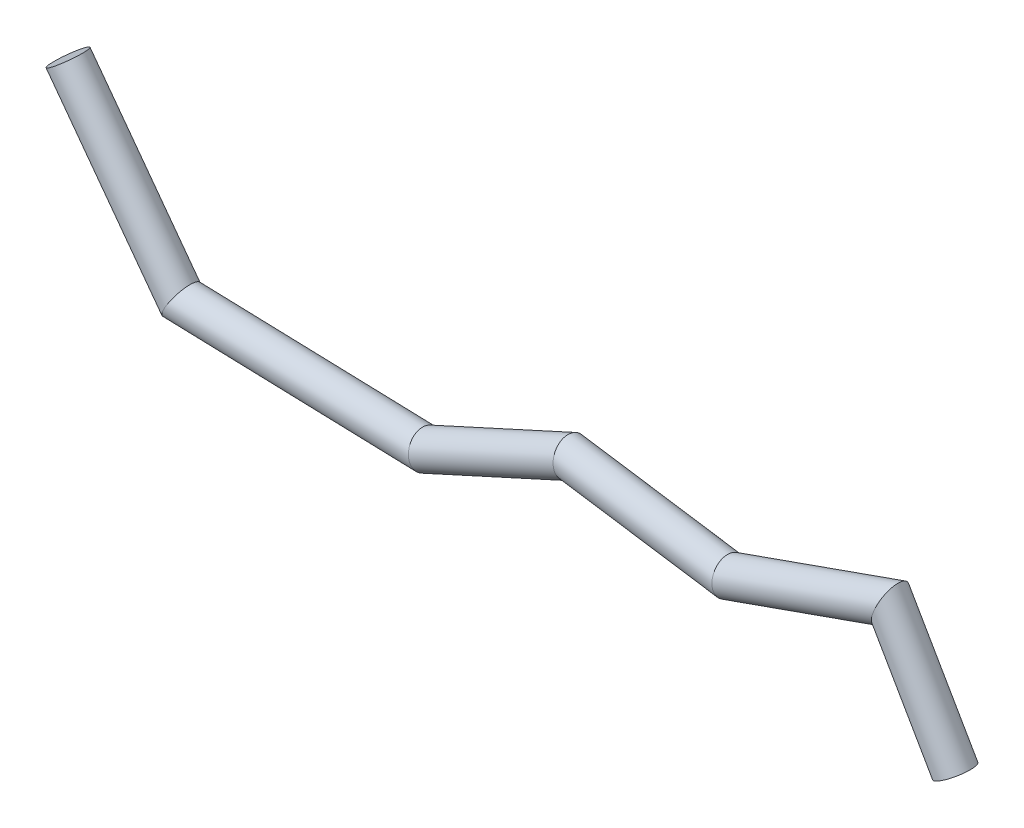
ISO-10303-21;
HEADER;
FILE_DESCRIPTION(('STEP AP214'),'2;1');
FILE_NAME('part.step','',(''),(''),'','','');
FILE_SCHEMA(('AUTOMOTIVE_DESIGN { 1 0 10303 214 1 1 1 1 }'));
ENDSEC;
DATA;
#1=APPLICATION_CONTEXT('core data for automotive mechanical design processes');
#2=APPLICATION_PROTOCOL_DEFINITION('international standard','automotive_design',2000,#1);
#3=PRODUCT_CONTEXT('',#1,'mechanical');
#4=PRODUCT('Part','Part','',(#3));
#5=PRODUCT_RELATED_PRODUCT_CATEGORY('part','',(#4));
#6=PRODUCT_DEFINITION_FORMATION('','',#4);
#7=PRODUCT_DEFINITION_CONTEXT('part definition',#1,'design');
#8=PRODUCT_DEFINITION('design','',#6,#7);
#9=PRODUCT_DEFINITION_SHAPE('','',#8);
#10=(LENGTH_UNIT() NAMED_UNIT(*) SI_UNIT(.MILLI.,.METRE.));
#11=(NAMED_UNIT(*) PLANE_ANGLE_UNIT() SI_UNIT($,.RADIAN.));
#12=(NAMED_UNIT(*) SI_UNIT($,.STERADIAN.) SOLID_ANGLE_UNIT());
#13=UNCERTAINTY_MEASURE_WITH_UNIT(LENGTH_MEASURE(1.E-05),#10,'distance_accuracy_value','');
#14=(GEOMETRIC_REPRESENTATION_CONTEXT(3) GLOBAL_UNCERTAINTY_ASSIGNED_CONTEXT((#13)) GLOBAL_UNIT_ASSIGNED_CONTEXT((#10,
#11,#12)) REPRESENTATION_CONTEXT('',''));
#15=CARTESIAN_POINT('',(0.,0.,0.));
#16=DIRECTION('',(0.,0.,1.));
#17=DIRECTION('',(1.,0.,0.));
#18=AXIS2_PLACEMENT_3D('',#15,#16,#17);
#19=CARTESIAN_POINT('',(206.911794095566,-39.1941350261347,0.));
#20=DIRECTION('',(-0.499225610396475,0.86647203643526,0.));
#21=DIRECTION('',(-0.86647203643526,-0.499225610396475,0.));
#22=AXIS2_PLACEMENT_3D('',#19,#20,#21);
#23=PLANE('',#22);
#24=CARTESIAN_POINT('',(206.911794095566,-39.1941350261347,0.));
#25=DIRECTION('',(-0.499225610396475,0.86647203643526,0.));
#26=DIRECTION('',(-0.86647203643526,-0.499225610396475,0.));
#27=AXIS2_PLACEMENT_3D('',#24,#25,#26);
#28=CIRCLE('',#27,6.35);
#29=CARTESIAN_POINT('',(201.409696664202,-42.3642176521523,0.));
#30=VERTEX_POINT('',#29);
#31=EDGE_CURVE('E44',#30,#30,#28,.T.);
#32=ORIENTED_EDGE('',*,*,#31,.F.);
#33=EDGE_LOOP('',(#32));
#34=FACE_BOUND('',#33,.T.);
#35=ADVANCED_FACE('F41',(#34),#23,.F.);
#36=CARTESIAN_POINT('',(-121.321774851215,25.3446173490553,0.));
#37=DIRECTION('',(-0.594944836564214,0.803766534166223,0.));
#38=DIRECTION('',(-0.803766534166223,-0.594944836564214,0.));
#39=AXIS2_PLACEMENT_3D('',#36,#37,#38);
#40=PLANE('',#39);
#41=CARTESIAN_POINT('',(-121.321774851215,25.3446173490553,0.));
#42=DIRECTION('',(-0.594944836564214,0.803766534166223,0.));
#43=DIRECTION('',(-0.803766534166223,-0.594944836564214,0.));
#44=AXIS2_PLACEMENT_3D('',#41,#42,#43);
#45=CIRCLE('',#44,6.35);
#46=CARTESIAN_POINT('',(-126.425692343171,21.5667176368726,0.));
#47=VERTEX_POINT('',#46);
#48=EDGE_CURVE('E48',#47,#47,#45,.T.);
#49=ORIENTED_EDGE('',*,*,#48,.T.);
#50=EDGE_LOOP('',(#49));
#51=FACE_BOUND('',#50,.T.);
#52=ADVANCED_FACE('F73',(#51),#40,.T.);
#53=CARTESIAN_POINT('',(179.862542994585,7.75341573533876,0.));
#54=DIRECTION('',(0.499225610396475,-0.86647203643526,0.));
#55=DIRECTION('',(0.86647203643526,0.499225610396475,0.));
#56=AXIS2_PLACEMENT_3D('',#53,#54,#55);
#57=CYLINDRICAL_SURFACE('',#56,6.35);
#58=CARTESIAN_POINT('',(182.813633337448,2.63140835864512,0.));
#59=DIRECTION('',(0.937939452659395,-0.34679905297592,0.));
#60=DIRECTION('',(0.34679905297592,0.937939452659395,0.));
#61=AXIS2_PLACEMENT_3D('',#58,#59,#60);
#62=ELLIPSE('',#61,8.26032294661291,6.35);
#63=CARTESIAN_POINT('',(185.678305512609,10.3790911419811,0.));
#64=VERTEX_POINT('',#63);
#65=EDGE_CURVE('E63',#64,#64,#62,.T.);
#66=ORIENTED_EDGE('',*,*,#65,.T.);
#67=EDGE_LOOP('',(#66));
#68=FACE_BOUND('',#67,.T.);
#69=ORIENTED_EDGE('',*,*,#31,.T.);
#70=EDGE_LOOP('',(#69));
#71=FACE_BOUND('',#70,.T.);
#72=ADVANCED_FACE('F70',(#68,#71),#57,.T.);
#73=CARTESIAN_POINT('',(121.521290152623,-19.0347222555255,0.));
#74=DIRECTION('',(0.942828305141861,0.333278842747821,0.));
#75=DIRECTION('',(-0.333278842747821,0.942828305141861,0.));
#76=AXIS2_PLACEMENT_3D('',#73,#74,#75);
#77=CYLINDRICAL_SURFACE('',#76,6.35);
#78=CARTESIAN_POINT('',(123.260707326007,-18.4198585105156,0.));
#79=DIRECTION('',(0.995492474005527,0.0948405725328256,0.));
#80=DIRECTION('',(0.0948405725328256,-0.995492474005528,0.));
#81=AXIS2_PLACEMENT_3D('',#78,#79,#80);
#82=ELLIPSE('',#81,6.54513105030198,6.35);
#83=CARTESIAN_POINT('',(123.88145130212,-24.9354872124711,0.));
#84=VERTEX_POINT('',#83);
#85=EDGE_CURVE('E61',#84,#84,#82,.T.);
#86=ORIENTED_EDGE('',*,*,#85,.T.);
#87=EDGE_LOOP('',(#86));
#88=FACE_BOUND('',#87,.T.);
#89=ORIENTED_EDGE('',*,*,#65,.F.);
#90=EDGE_LOOP('',(#89));
#91=FACE_BOUND('',#90,.T.);
#92=ADVANCED_FACE('F97',(#88,#91),#77,.T.);
#93=CARTESIAN_POINT('',(62.3877901477382,-9.23149365341844,0.));
#94=DIRECTION('',(0.988799086686588,-0.149252692330051,0.));
#95=DIRECTION('',(0.149252692330051,0.988799086686588,0.));
#96=AXIS2_PLACEMENT_3D('',#93,#94,#95);
#97=CYLINDRICAL_SURFACE('',#96,6.35);
#98=CARTESIAN_POINT('',(64.53875237519,-9.55616719718478,0.));
#99=DIRECTION('',(0.990356045953145,0.138545668442043,0.));
#100=DIRECTION('',(-0.138545668442043,0.990356045953145,0.));
#101=AXIS2_PLACEMENT_3D('',#98,#99,#100);
#102=ELLIPSE('',#101,6.62434845301589,6.35);
#103=CARTESIAN_POINT('',(63.6209775907739,-2.99570365624013,0.));
#104=VERTEX_POINT('',#103);
#105=EDGE_CURVE('E58',#104,#104,#102,.T.);
#106=ORIENTED_EDGE('',*,*,#105,.T.);
#107=EDGE_LOOP('',(#106));
#108=FACE_BOUND('',#107,.T.);
#109=ORIENTED_EDGE('',*,*,#85,.F.);
#110=EDGE_LOOP('',(#109));
#111=FACE_BOUND('',#110,.T.);
#112=ADVANCED_FACE('F93',(#108,#111),#97,.T.);
#113=CARTESIAN_POINT('',(9.5059869707132,-34.6488270707286,0.));
#114=DIRECTION('',(0.90988149643985,0.414868247081382,0.));
#115=DIRECTION('',(-0.414868247081382,0.90988149643985,0.));
#116=AXIS2_PLACEMENT_3D('',#113,#114,#115);
#117=CYLINDRICAL_SURFACE('',#116,6.35);
#118=CARTESIAN_POINT('',(11.0796141416635,-33.9313183088445,0.));
#119=DIRECTION('',(0.980341141661211,0.197310025002261,0.));
#120=DIRECTION('',(0.197310025002261,-0.980341141661211,0.));
#121=AXIS2_PLACEMENT_3D('',#118,#119,#120);
#122=ELLIPSE('',#121,6.52049845525589,6.35);
#123=CARTESIAN_POINT('',(12.3661738548973,-40.3236312086702,0.));
#124=VERTEX_POINT('',#123);
#125=EDGE_CURVE('E53',#124,#124,#122,.T.);
#126=ORIENTED_EDGE('',*,*,#125,.T.);
#127=EDGE_LOOP('',(#126));
#128=FACE_BOUND('',#127,.T.);
#129=ORIENTED_EDGE('',*,*,#105,.F.);
#130=EDGE_LOOP('',(#129));
#131=FACE_BOUND('',#130,.T.);
#132=ADVANCED_FACE('F86',(#128,#131),#117,.T.);
#133=CARTESIAN_POINT('',(-82.9817932723009,-31.0548226692737,0.));
#134=DIRECTION('',(0.999532727722983,-0.0305667500832715,0.));
#135=DIRECTION('',(0.0305667500832715,0.999532727722983,0.));
#136=AXIS2_PLACEMENT_3D('',#133,#134,#135);
#137=CYLINDRICAL_SURFACE('',#136,6.35);
#138=CARTESIAN_POINT('',(-79.4962314664357,-31.1614147734286,0.));
#139=DIRECTION('',(0.886029995135768,-0.46362791947823,0.));
#140=DIRECTION('',(-0.46362791947823,-0.886029995135768,0.));
#141=AXIS2_PLACEMENT_3D('',#138,#139,#140);
#142=ELLIPSE('',#141,7.0572212430312,6.35);
#143=CARTESIAN_POINT('',(-82.7681562686398,-37.4143244770636,0.));
#144=VERTEX_POINT('',#143);
#145=EDGE_CURVE('E11',#144,#144,#142,.T.);
#146=ORIENTED_EDGE('',*,*,#145,.T.);
#147=EDGE_LOOP('',(#146));
#148=FACE_BOUND('',#147,.T.);
#149=ORIENTED_EDGE('',*,*,#125,.F.);
#150=EDGE_LOOP('',(#149));
#151=FACE_BOUND('',#150,.T.);
#152=ADVANCED_FACE('F80',(#148,#151),#137,.T.);
#153=CARTESIAN_POINT('',(-121.321774851215,25.3446173490553,0.));
#154=DIRECTION('',(0.594944836564214,-0.803766534166222,0.));
#155=DIRECTION('',(0.803766534166222,0.594944836564214,0.));
#156=AXIS2_PLACEMENT_3D('',#153,#154,#155);
#157=CYLINDRICAL_SURFACE('',#156,6.35);
#158=ORIENTED_EDGE('',*,*,#48,.F.);
#159=EDGE_LOOP('',(#158));
#160=FACE_BOUND('',#159,.T.);
#161=ORIENTED_EDGE('',*,*,#145,.F.);
#162=EDGE_LOOP('',(#161));
#163=FACE_BOUND('',#162,.T.);
#164=ADVANCED_FACE('F78',(#160,#163),#157,.T.);
#165=CLOSED_SHELL('',(#35,#52,#72,#92,#112,#132,#152,#164));
#166=MANIFOLD_SOLID_BREP('B2',#165);
#167=ADVANCED_BREP_SHAPE_REPRESENTATION('',(#18,#166),#14);
#168=SHAPE_DEFINITION_REPRESENTATION(#9,#167);
ENDSEC;
END-ISO-10303-21;
